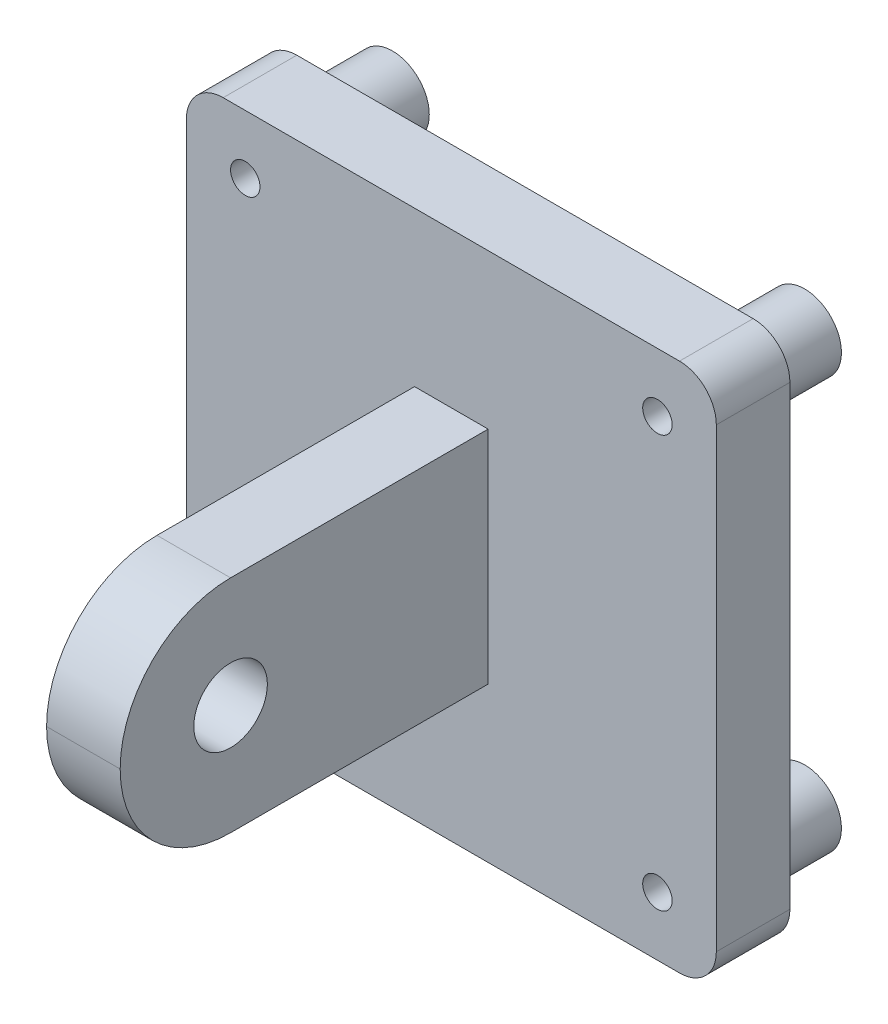
ISO-10303-21;
HEADER;
FILE_DESCRIPTION(('STEP AP214'),'2;1');
FILE_NAME('part.step','',(''),(''),'','','');
FILE_SCHEMA(('AUTOMOTIVE_DESIGN { 1 0 10303 214 1 1 1 1 }'));
ENDSEC;
DATA;
#1=APPLICATION_CONTEXT('core data for automotive mechanical design processes');
#2=APPLICATION_PROTOCOL_DEFINITION('international standard','automotive_design',2000,#1);
#3=PRODUCT_CONTEXT('',#1,'mechanical');
#4=PRODUCT('Part','Part','',(#3));
#5=PRODUCT_RELATED_PRODUCT_CATEGORY('part','',(#4));
#6=PRODUCT_DEFINITION_FORMATION('','',#4);
#7=PRODUCT_DEFINITION_CONTEXT('part definition',#1,'design');
#8=PRODUCT_DEFINITION('design','',#6,#7);
#9=PRODUCT_DEFINITION_SHAPE('','',#8);
#10=(LENGTH_UNIT() NAMED_UNIT(*) SI_UNIT(.MILLI.,.METRE.));
#11=(NAMED_UNIT(*) PLANE_ANGLE_UNIT() SI_UNIT($,.RADIAN.));
#12=(NAMED_UNIT(*) SI_UNIT($,.STERADIAN.) SOLID_ANGLE_UNIT());
#13=UNCERTAINTY_MEASURE_WITH_UNIT(LENGTH_MEASURE(1.E-05),#10,'distance_accuracy_value','');
#14=(GEOMETRIC_REPRESENTATION_CONTEXT(3) GLOBAL_UNCERTAINTY_ASSIGNED_CONTEXT((#13)) GLOBAL_UNIT_ASSIGNED_CONTEXT((#10,
#11,#12)) REPRESENTATION_CONTEXT('',''));
#15=CARTESIAN_POINT('',(0.,0.,0.));
#16=DIRECTION('',(0.,0.,1.));
#17=DIRECTION('',(1.,0.,0.));
#18=AXIS2_PLACEMENT_3D('',#15,#16,#17);
#19=CARTESIAN_POINT('',(14.,14.,-5.));
#20=DIRECTION('',(0.,0.,1.));
#21=DIRECTION('',(1.,0.,0.));
#22=AXIS2_PLACEMENT_3D('',#19,#20,#21);
#23=CYLINDRICAL_SURFACE('',#22,1.);
#24=CARTESIAN_POINT('',(14.,14.,-5.));
#25=DIRECTION('',(0.,0.,1.));
#26=DIRECTION('',(1.,0.,0.));
#27=AXIS2_PLACEMENT_3D('',#24,#25,#26);
#28=CIRCLE('',#27,1.);
#29=CARTESIAN_POINT('',(15.,14.,-5.));
#30=VERTEX_POINT('',#29);
#31=EDGE_CURVE('E47',#30,#30,#28,.T.);
#32=ORIENTED_EDGE('',*,*,#31,.F.);
#33=EDGE_LOOP('',(#32));
#34=FACE_BOUND('',#33,.T.);
#35=CARTESIAN_POINT('',(14.,14.,0.));
#36=DIRECTION('',(0.,0.,1.));
#37=DIRECTION('',(1.,0.,0.));
#38=AXIS2_PLACEMENT_3D('',#35,#36,#37);
#39=CIRCLE('',#38,1.);
#40=CARTESIAN_POINT('',(15.,14.,0.));
#41=VERTEX_POINT('',#40);
#42=EDGE_CURVE('E53',#41,#41,#39,.T.);
#43=ORIENTED_EDGE('',*,*,#42,.T.);
#44=EDGE_LOOP('',(#43));
#45=FACE_BOUND('',#44,.T.);
#46=ADVANCED_FACE('F40',(#34,#45),#23,.F.);
#47=CARTESIAN_POINT('',(14.,14.,-5.));
#48=DIRECTION('',(0.,0.,1.));
#49=DIRECTION('',(1.,0.,0.));
#50=AXIS2_PLACEMENT_3D('',#47,#48,#49);
#51=CYLINDRICAL_SURFACE('',#50,2.5);
#52=CARTESIAN_POINT('',(14.,14.,-5.));
#53=DIRECTION('',(0.,0.,1.));
#54=DIRECTION('',(1.,0.,0.));
#55=AXIS2_PLACEMENT_3D('',#52,#53,#54);
#56=CIRCLE('',#55,2.5);
#57=CARTESIAN_POINT('',(16.5,14.,-5.));
#58=VERTEX_POINT('',#57);
#59=EDGE_CURVE('E11',#58,#58,#56,.T.);
#60=ORIENTED_EDGE('',*,*,#59,.T.);
#61=EDGE_LOOP('',(#60));
#62=FACE_BOUND('',#61,.T.);
#63=CARTESIAN_POINT('',(14.,14.,0.));
#64=DIRECTION('',(0.,0.,1.));
#65=DIRECTION('',(1.,0.,0.));
#66=AXIS2_PLACEMENT_3D('',#63,#64,#65);
#67=CIRCLE('',#66,2.5);
#68=CARTESIAN_POINT('',(16.5,14.,0.));
#69=VERTEX_POINT('',#68);
#70=EDGE_CURVE('E43',#69,#69,#67,.T.);
#71=ORIENTED_EDGE('',*,*,#70,.F.);
#72=EDGE_LOOP('',(#71));
#73=FACE_BOUND('',#72,.T.);
#74=ADVANCED_FACE('F62',(#62,#73),#51,.T.);
#75=CARTESIAN_POINT('',(0.,0.,-5.));
#76=DIRECTION('',(0.,0.,1.));
#77=DIRECTION('',(1.,0.,0.));
#78=AXIS2_PLACEMENT_3D('',#75,#76,#77);
#79=PLANE('',#78);
#80=ORIENTED_EDGE('',*,*,#31,.T.);
#81=EDGE_LOOP('',(#80));
#82=FACE_BOUND('',#81,.T.);
#83=ORIENTED_EDGE('',*,*,#59,.F.);
#84=EDGE_LOOP('',(#83));
#85=FACE_BOUND('',#84,.T.);
#86=ADVANCED_FACE('F64',(#82,#85),#79,.F.);
#87=CARTESIAN_POINT('',(0.,0.,0.));
#88=DIRECTION('',(0.,0.,1.));
#89=DIRECTION('',(1.,0.,0.));
#90=AXIS2_PLACEMENT_3D('',#87,#88,#89);
#91=PLANE('',#90);
#92=ORIENTED_EDGE('',*,*,#42,.F.);
#93=EDGE_LOOP('',(#92));
#94=FACE_BOUND('',#93,.T.);
#95=ORIENTED_EDGE('',*,*,#70,.T.);
#96=EDGE_LOOP('',(#95));
#97=FACE_BOUND('',#96,.T.);
#98=ADVANCED_FACE('F60',(#94,#97),#91,.T.);
#99=CLOSED_SHELL('',(#46,#74,#86,#98));
#100=MANIFOLD_SOLID_BREP('B2',#99);
#101=CARTESIAN_POINT('',(0.,0.,5.));
#102=DIRECTION('',(0.,0.,1.));
#103=DIRECTION('',(1.,0.,0.));
#104=AXIS2_PLACEMENT_3D('',#101,#102,#103);
#105=PLANE('',#104);
#106=CARTESIAN_POINT('',(-14.,14.,5.));
#107=DIRECTION('',(0.,0.,1.));
#108=DIRECTION('',(1.,0.,0.));
#109=AXIS2_PLACEMENT_3D('',#106,#107,#108);
#110=CIRCLE('',#109,1.);
#111=CARTESIAN_POINT('',(-13.,14.,5.));
#112=VERTEX_POINT('',#111);
#113=EDGE_CURVE('E251',#112,#112,#110,.T.);
#114=ORIENTED_EDGE('',*,*,#113,.F.);
#115=EDGE_LOOP('',(#114));
#116=FACE_BOUND('',#115,.T.);
#117=CARTESIAN_POINT('',(14.,14.,5.));
#118=DIRECTION('',(0.,0.,1.));
#119=DIRECTION('',(1.,0.,0.));
#120=AXIS2_PLACEMENT_3D('',#117,#118,#119);
#121=CIRCLE('',#120,1.);
#122=CARTESIAN_POINT('',(15.,14.,5.));
#123=VERTEX_POINT('',#122);
#124=EDGE_CURVE('E254',#123,#123,#121,.T.);
#125=ORIENTED_EDGE('',*,*,#124,.F.);
#126=EDGE_LOOP('',(#125));
#127=FACE_BOUND('',#126,.T.);
#128=CARTESIAN_POINT('',(14.,-14.,5.));
#129=DIRECTION('',(0.,0.,1.));
#130=DIRECTION('',(1.,0.,0.));
#131=AXIS2_PLACEMENT_3D('',#128,#129,#130);
#132=CIRCLE('',#131,1.);
#133=CARTESIAN_POINT('',(15.,-14.,5.));
#134=VERTEX_POINT('',#133);
#135=EDGE_CURVE('E258',#134,#134,#132,.T.);
#136=ORIENTED_EDGE('',*,*,#135,.F.);
#137=EDGE_LOOP('',(#136));
#138=FACE_BOUND('',#137,.T.);
#139=CARTESIAN_POINT('',(-14.,-14.,5.));
#140=DIRECTION('',(0.,0.,1.));
#141=DIRECTION('',(1.,0.,0.));
#142=AXIS2_PLACEMENT_3D('',#139,#140,#141);
#143=CIRCLE('',#142,1.);
#144=CARTESIAN_POINT('',(-13.,-14.,5.));
#145=VERTEX_POINT('',#144);
#146=EDGE_CURVE('E261',#145,#145,#143,.T.);
#147=ORIENTED_EDGE('',*,*,#146,.F.);
#148=EDGE_LOOP('',(#147));
#149=FACE_BOUND('',#148,.T.);
#150=DIRECTION('',(0.,1.,0.));
#151=VECTOR('',#150,1.);
#152=CARTESIAN_POINT('',(18.,0.,5.));
#153=LINE('',#152,#151);
#154=CARTESIAN_POINT('',(18.,-15.5,5.));
#155=VERTEX_POINT('',#154);
#156=CARTESIAN_POINT('',(18.,15.5,5.));
#157=VERTEX_POINT('',#156);
#158=EDGE_CURVE('E267',#155,#157,#153,.T.);
#159=ORIENTED_EDGE('',*,*,#158,.T.);
#160=CARTESIAN_POINT('',(15.5,15.5,5.));
#161=DIRECTION('',(0.,0.,1.));
#162=DIRECTION('',(1.,0.,0.));
#163=AXIS2_PLACEMENT_3D('',#160,#161,#162);
#164=CIRCLE('',#163,2.5);
#165=CARTESIAN_POINT('',(15.5,18.,5.));
#166=VERTEX_POINT('',#165);
#167=EDGE_CURVE('E322',#157,#166,#164,.T.);
#168=ORIENTED_EDGE('',*,*,#167,.T.);
#169=DIRECTION('',(1.,0.,0.));
#170=VECTOR('',#169,1.);
#171=CARTESIAN_POINT('',(0.,18.,5.));
#172=LINE('',#171,#170);
#173=CARTESIAN_POINT('',(-15.5,18.,5.));
#174=VERTEX_POINT('',#173);
#175=EDGE_CURVE('E270',#174,#166,#172,.T.);
#176=ORIENTED_EDGE('',*,*,#175,.F.);
#177=CARTESIAN_POINT('',(-15.5,15.5,5.));
#178=DIRECTION('',(0.,0.,1.));
#179=DIRECTION('',(1.,0.,0.));
#180=AXIS2_PLACEMENT_3D('',#177,#178,#179);
#181=CIRCLE('',#180,2.5);
#182=CARTESIAN_POINT('',(-18.,15.5,5.));
#183=VERTEX_POINT('',#182);
#184=EDGE_CURVE('E320',#174,#183,#181,.T.);
#185=ORIENTED_EDGE('',*,*,#184,.T.);
#186=DIRECTION('',(0.,1.,0.));
#187=VECTOR('',#186,1.);
#188=CARTESIAN_POINT('',(-18.,0.,5.));
#189=LINE('',#188,#187);
#190=CARTESIAN_POINT('',(-18.,-15.5,5.));
#191=VERTEX_POINT('',#190);
#192=EDGE_CURVE('E273',#191,#183,#189,.T.);
#193=ORIENTED_EDGE('',*,*,#192,.F.);
#194=CARTESIAN_POINT('',(-15.5,-15.5,5.));
#195=DIRECTION('',(0.,0.,1.));
#196=DIRECTION('',(1.,0.,0.));
#197=AXIS2_PLACEMENT_3D('',#194,#195,#196);
#198=CIRCLE('',#197,2.5);
#199=CARTESIAN_POINT('',(-15.5,-18.,5.));
#200=VERTEX_POINT('',#199);
#201=EDGE_CURVE('E318',#191,#200,#198,.T.);
#202=ORIENTED_EDGE('',*,*,#201,.T.);
#203=DIRECTION('',(1.,0.,0.));
#204=VECTOR('',#203,1.);
#205=CARTESIAN_POINT('',(0.,-18.,5.));
#206=LINE('',#205,#204);
#207=CARTESIAN_POINT('',(15.5,-18.,5.));
#208=VERTEX_POINT('',#207);
#209=EDGE_CURVE('E264',#200,#208,#206,.T.);
#210=ORIENTED_EDGE('',*,*,#209,.T.);
#211=CARTESIAN_POINT('',(15.5,-15.5,5.));
#212=DIRECTION('',(0.,0.,1.));
#213=DIRECTION('',(1.,0.,0.));
#214=AXIS2_PLACEMENT_3D('',#211,#212,#213);
#215=CIRCLE('',#214,2.5);
#216=EDGE_CURVE('E316',#208,#155,#215,.T.);
#217=ORIENTED_EDGE('',*,*,#216,.T.);
#218=EDGE_LOOP('',(#159,#168,#176,#185,#193,#202,#210,#217));
#219=FACE_BOUND('',#218,.T.);
#220=DIRECTION('',(-1.,0.,0.));
#221=VECTOR('',#220,1.);
#222=CARTESIAN_POINT('',(-2.5,7.5,5.));
#223=LINE('',#222,#221);
#224=CARTESIAN_POINT('',(2.5,7.5,5.));
#225=VERTEX_POINT('',#224);
#226=CARTESIAN_POINT('',(-2.5,7.5,5.));
#227=VERTEX_POINT('',#226);
#228=EDGE_CURVE('E204',#225,#227,#223,.T.);
#229=ORIENTED_EDGE('',*,*,#228,.F.);
#230=DIRECTION('',(0.,1.,0.));
#231=VECTOR('',#230,1.);
#232=CARTESIAN_POINT('',(2.5,-7.5,5.));
#233=LINE('',#232,#231);
#234=CARTESIAN_POINT('',(2.5,-7.5,5.));
#235=VERTEX_POINT('',#234);
#236=EDGE_CURVE('E213',#235,#225,#233,.T.);
#237=ORIENTED_EDGE('',*,*,#236,.F.);
#238=DIRECTION('',(1.,0.,0.));
#239=VECTOR('',#238,1.);
#240=CARTESIAN_POINT('',(-2.5,-7.5,5.));
#241=LINE('',#240,#239);
#242=CARTESIAN_POINT('',(-2.5,-7.5,5.));
#243=VERTEX_POINT('',#242);
#244=EDGE_CURVE('E224',#243,#235,#241,.T.);
#245=ORIENTED_EDGE('',*,*,#244,.F.);
#246=DIRECTION('',(0.,-1.,0.));
#247=VECTOR('',#246,1.);
#248=CARTESIAN_POINT('',(-2.5,-7.5,5.));
#249=LINE('',#248,#247);
#250=EDGE_CURVE('E222',#227,#243,#249,.T.);
#251=ORIENTED_EDGE('',*,*,#250,.F.);
#252=EDGE_LOOP('',(#229,#237,#245,#251));
#253=FACE_BOUND('',#252,.T.);
#254=ADVANCED_FACE('F108',(#116,#127,#138,#149,#219,#253),#105,.T.);
#255=CARTESIAN_POINT('',(-14.,14.,-5.));
#256=DIRECTION('',(0.,0.,1.));
#257=DIRECTION('',(1.,0.,0.));
#258=AXIS2_PLACEMENT_3D('',#255,#256,#257);
#259=CYLINDRICAL_SURFACE('',#258,2.5);
#260=CARTESIAN_POINT('',(-14.,14.,-5.));
#261=DIRECTION('',(0.,0.,1.));
#262=DIRECTION('',(1.,0.,0.));
#263=AXIS2_PLACEMENT_3D('',#260,#261,#262);
#264=CIRCLE('',#263,2.5);
#265=CARTESIAN_POINT('',(-11.5,14.,-5.));
#266=VERTEX_POINT('',#265);
#267=EDGE_CURVE('E290',#266,#266,#264,.T.);
#268=ORIENTED_EDGE('',*,*,#267,.T.);
#269=EDGE_LOOP('',(#268));
#270=FACE_BOUND('',#269,.T.);
#271=CARTESIAN_POINT('',(-14.,14.,0.));
#272=DIRECTION('',(0.,0.,1.));
#273=DIRECTION('',(1.,0.,0.));
#274=AXIS2_PLACEMENT_3D('',#271,#272,#273);
#275=CIRCLE('',#274,2.5);
#276=CARTESIAN_POINT('',(-11.5,14.,0.));
#277=VERTEX_POINT('',#276);
#278=EDGE_CURVE('E276',#277,#277,#275,.T.);
#279=ORIENTED_EDGE('',*,*,#278,.F.);
#280=EDGE_LOOP('',(#279));
#281=FACE_BOUND('',#280,.T.);
#282=ADVANCED_FACE('F376',(#270,#281),#259,.T.);
#283=CARTESIAN_POINT('',(-14.,14.,-5.));
#284=DIRECTION('',(0.,0.,1.));
#285=DIRECTION('',(1.,0.,0.));
#286=AXIS2_PLACEMENT_3D('',#283,#284,#285);
#287=CYLINDRICAL_SURFACE('',#286,1.);
#288=CARTESIAN_POINT('',(-14.,14.,-5.));
#289=DIRECTION('',(0.,0.,1.));
#290=DIRECTION('',(1.,0.,0.));
#291=AXIS2_PLACEMENT_3D('',#288,#289,#290);
#292=CIRCLE('',#291,1.);
#293=CARTESIAN_POINT('',(-13.,14.,-5.));
#294=VERTEX_POINT('',#293);
#295=EDGE_CURVE('E293',#294,#294,#292,.T.);
#296=ORIENTED_EDGE('',*,*,#295,.F.);
#297=EDGE_LOOP('',(#296));
#298=FACE_BOUND('',#297,.T.);
#299=ORIENTED_EDGE('',*,*,#113,.T.);
#300=EDGE_LOOP('',(#299));
#301=FACE_BOUND('',#300,.T.);
#302=ADVANCED_FACE('F384',(#298,#301),#287,.F.);
#303=CARTESIAN_POINT('',(0.,0.,-5.));
#304=DIRECTION('',(0.,0.,1.));
#305=DIRECTION('',(1.,0.,0.));
#306=AXIS2_PLACEMENT_3D('',#303,#304,#305);
#307=PLANE('',#306);
#308=ORIENTED_EDGE('',*,*,#267,.F.);
#309=EDGE_LOOP('',(#308));
#310=FACE_BOUND('',#309,.T.);
#311=ORIENTED_EDGE('',*,*,#295,.T.);
#312=EDGE_LOOP('',(#311));
#313=FACE_BOUND('',#312,.T.);
#314=ADVANCED_FACE('F414',(#310,#313),#307,.F.);
#315=CARTESIAN_POINT('',(0.,-18.,5.));
#316=DIRECTION('',(0.,1.,0.));
#317=DIRECTION('',(0.,0.,1.));
#318=AXIS2_PLACEMENT_3D('',#315,#316,#317);
#319=PLANE('',#318);
#320=ORIENTED_EDGE('',*,*,#209,.F.);
#321=DIRECTION('',(0.,0.,-1.));
#322=VECTOR('',#321,1.);
#323=CARTESIAN_POINT('',(-15.5,-18.,0.));
#324=LINE('',#323,#322);
#325=CARTESIAN_POINT('',(-15.5,-18.,0.));
#326=VERTEX_POINT('',#325);
#327=EDGE_CURVE('E331',#200,#326,#324,.T.);
#328=ORIENTED_EDGE('',*,*,#327,.T.);
#329=DIRECTION('',(1.,0.,0.));
#330=VECTOR('',#329,1.);
#331=CARTESIAN_POINT('',(0.,-18.,0.));
#332=LINE('',#331,#330);
#333=CARTESIAN_POINT('',(15.5,-18.,0.));
#334=VERTEX_POINT('',#333);
#335=EDGE_CURVE('E279',#326,#334,#332,.T.);
#336=ORIENTED_EDGE('',*,*,#335,.T.);
#337=DIRECTION('',(0.,0.,-1.));
#338=VECTOR('',#337,1.);
#339=CARTESIAN_POINT('',(15.5,-18.,5.));
#340=LINE('',#339,#338);
#341=EDGE_CURVE('E329',#334,#208,#340,.F.);
#342=ORIENTED_EDGE('',*,*,#341,.T.);
#343=EDGE_LOOP('',(#320,#328,#336,#342));
#344=FACE_BOUND('',#343,.T.);
#345=ADVANCED_FACE('F410',(#344),#319,.F.);
#346=CARTESIAN_POINT('',(18.,0.,5.));
#347=DIRECTION('',(-1.,0.,0.));
#348=DIRECTION('',(0.,0.,1.));
#349=AXIS2_PLACEMENT_3D('',#346,#347,#348);
#350=PLANE('',#349);
#351=DIRECTION('',(0.,1.,0.));
#352=VECTOR('',#351,1.);
#353=CARTESIAN_POINT('',(18.,0.,0.));
#354=LINE('',#353,#352);
#355=CARTESIAN_POINT('',(18.,-15.5,0.));
#356=VERTEX_POINT('',#355);
#357=CARTESIAN_POINT('',(18.,15.5,0.));
#358=VERTEX_POINT('',#357);
#359=EDGE_CURVE('E282',#356,#358,#354,.T.);
#360=ORIENTED_EDGE('',*,*,#359,.T.);
#361=DIRECTION('',(0.,0.,-1.));
#362=VECTOR('',#361,1.);
#363=CARTESIAN_POINT('',(18.,15.5,5.));
#364=LINE('',#363,#362);
#365=EDGE_CURVE('E314',#358,#157,#364,.F.);
#366=ORIENTED_EDGE('',*,*,#365,.T.);
#367=ORIENTED_EDGE('',*,*,#158,.F.);
#368=DIRECTION('',(0.,0.,-1.));
#369=VECTOR('',#368,1.);
#370=CARTESIAN_POINT('',(18.,-15.5,5.));
#371=LINE('',#370,#369);
#372=EDGE_CURVE('E311',#155,#356,#371,.T.);
#373=ORIENTED_EDGE('',*,*,#372,.T.);
#374=EDGE_LOOP('',(#360,#366,#367,#373));
#375=FACE_BOUND('',#374,.T.);
#376=ADVANCED_FACE('F406',(#375),#350,.F.);
#377=CARTESIAN_POINT('',(0.,18.,5.));
#378=DIRECTION('',(0.,1.,0.));
#379=DIRECTION('',(0.,0.,1.));
#380=AXIS2_PLACEMENT_3D('',#377,#378,#379);
#381=PLANE('',#380);
#382=ORIENTED_EDGE('',*,*,#175,.T.);
#383=DIRECTION('',(0.,0.,-1.));
#384=VECTOR('',#383,1.);
#385=CARTESIAN_POINT('',(15.5,18.,0.));
#386=LINE('',#385,#384);
#387=CARTESIAN_POINT('',(15.5,18.,0.));
#388=VERTEX_POINT('',#387);
#389=EDGE_CURVE('E300',#166,#388,#386,.T.);
#390=ORIENTED_EDGE('',*,*,#389,.T.);
#391=DIRECTION('',(1.,0.,0.));
#392=VECTOR('',#391,1.);
#393=CARTESIAN_POINT('',(0.,18.,0.));
#394=LINE('',#393,#392);
#395=CARTESIAN_POINT('',(-15.5,18.,0.));
#396=VERTEX_POINT('',#395);
#397=EDGE_CURVE('E285',#396,#388,#394,.T.);
#398=ORIENTED_EDGE('',*,*,#397,.F.);
#399=DIRECTION('',(0.,0.,-1.));
#400=VECTOR('',#399,1.);
#401=CARTESIAN_POINT('',(-15.5,18.,5.));
#402=LINE('',#401,#400);
#403=EDGE_CURVE('E296',#396,#174,#402,.F.);
#404=ORIENTED_EDGE('',*,*,#403,.T.);
#405=EDGE_LOOP('',(#382,#390,#398,#404));
#406=FACE_BOUND('',#405,.T.);
#407=ADVANCED_FACE('F402',(#406),#381,.T.);
#408=CARTESIAN_POINT('',(-14.,-14.,5.));
#409=DIRECTION('',(0.,0.,-1.));
#410=DIRECTION('',(-1.,0.,0.));
#411=AXIS2_PLACEMENT_3D('',#408,#409,#410);
#412=CYLINDRICAL_SURFACE('',#411,1.);
#413=ORIENTED_EDGE('',*,*,#146,.T.);
#414=EDGE_LOOP('',(#413));
#415=FACE_BOUND('',#414,.T.);
#416=CARTESIAN_POINT('',(-14.,-14.,-5.));
#417=DIRECTION('',(0.,0.,1.));
#418=DIRECTION('',(1.,0.,0.));
#419=AXIS2_PLACEMENT_3D('',#416,#417,#418);
#420=CIRCLE('',#419,1.);
#421=CARTESIAN_POINT('',(-13.,-14.,-5.));
#422=VERTEX_POINT('',#421);
#423=EDGE_CURVE('E245',#422,#422,#420,.T.);
#424=ORIENTED_EDGE('',*,*,#423,.F.);
#425=EDGE_LOOP('',(#424));
#426=FACE_BOUND('',#425,.T.);
#427=ADVANCED_FACE('F405',(#415,#426),#412,.F.);
#428=CARTESIAN_POINT('',(14.,-14.,5.));
#429=DIRECTION('',(0.,0.,-1.));
#430=DIRECTION('',(-1.,0.,0.));
#431=AXIS2_PLACEMENT_3D('',#428,#429,#430);
#432=CYLINDRICAL_SURFACE('',#431,1.);
#433=ORIENTED_EDGE('',*,*,#135,.T.);
#434=EDGE_LOOP('',(#433));
#435=FACE_BOUND('',#434,.T.);
#436=CARTESIAN_POINT('',(14.,-14.,-5.));
#437=DIRECTION('',(0.,0.,1.));
#438=DIRECTION('',(1.,0.,0.));
#439=AXIS2_PLACEMENT_3D('',#436,#437,#438);
#440=CIRCLE('',#439,1.);
#441=CARTESIAN_POINT('',(15.,-14.,-5.));
#442=VERTEX_POINT('',#441);
#443=EDGE_CURVE('E233',#442,#442,#440,.T.);
#444=ORIENTED_EDGE('',*,*,#443,.F.);
#445=EDGE_LOOP('',(#444));
#446=FACE_BOUND('',#445,.T.);
#447=ADVANCED_FACE('F418',(#435,#446),#432,.F.);
#448=CARTESIAN_POINT('',(14.,14.,5.));
#449=DIRECTION('',(0.,0.,-1.));
#450=DIRECTION('',(-1.,0.,0.));
#451=AXIS2_PLACEMENT_3D('',#448,#449,#450);
#452=CYLINDRICAL_SURFACE('',#451,1.);
#453=ORIENTED_EDGE('',*,*,#124,.T.);
#454=EDGE_LOOP('',(#453));
#455=FACE_BOUND('',#454,.T.);
#456=CARTESIAN_POINT('',(14.,14.,0.));
#457=DIRECTION('',(0.,0.,1.));
#458=DIRECTION('',(1.,0.,0.));
#459=AXIS2_PLACEMENT_3D('',#456,#457,#458);
#460=CIRCLE('',#459,1.);
#461=CARTESIAN_POINT('',(15.,14.,0.));
#462=VERTEX_POINT('',#461);
#463=EDGE_CURVE('E248',#462,#462,#460,.T.);
#464=ORIENTED_EDGE('',*,*,#463,.F.);
#465=EDGE_LOOP('',(#464));
#466=FACE_BOUND('',#465,.T.);
#467=ADVANCED_FACE('F400',(#455,#466),#452,.F.);
#468=CARTESIAN_POINT('',(-18.,0.,5.));
#469=DIRECTION('',(-1.,0.,0.));
#470=DIRECTION('',(0.,0.,1.));
#471=AXIS2_PLACEMENT_3D('',#468,#469,#470);
#472=PLANE('',#471);
#473=ORIENTED_EDGE('',*,*,#192,.T.);
#474=DIRECTION('',(0.,0.,-1.));
#475=VECTOR('',#474,1.);
#476=CARTESIAN_POINT('',(-18.,15.5,5.));
#477=LINE('',#476,#475);
#478=CARTESIAN_POINT('',(-18.,15.5,0.));
#479=VERTEX_POINT('',#478);
#480=EDGE_CURVE('E326',#183,#479,#477,.T.);
#481=ORIENTED_EDGE('',*,*,#480,.T.);
#482=DIRECTION('',(0.,1.,0.));
#483=VECTOR('',#482,1.);
#484=CARTESIAN_POINT('',(-18.,0.,0.));
#485=LINE('',#484,#483);
#486=CARTESIAN_POINT('',(-18.,-15.5,0.));
#487=VERTEX_POINT('',#486);
#488=EDGE_CURVE('E255',#487,#479,#485,.T.);
#489=ORIENTED_EDGE('',*,*,#488,.F.);
#490=DIRECTION('',(0.,0.,-1.));
#491=VECTOR('',#490,1.);
#492=CARTESIAN_POINT('',(-18.,-15.5,5.));
#493=LINE('',#492,#491);
#494=EDGE_CURVE('E324',#487,#191,#493,.F.);
#495=ORIENTED_EDGE('',*,*,#494,.T.);
#496=EDGE_LOOP('',(#473,#481,#489,#495));
#497=FACE_BOUND('',#496,.T.);
#498=ADVANCED_FACE('F396',(#497),#472,.T.);
#499=CARTESIAN_POINT('',(0.,0.,0.));
#500=DIRECTION('',(0.,0.,1.));
#501=DIRECTION('',(1.,0.,0.));
#502=AXIS2_PLACEMENT_3D('',#499,#500,#501);
#503=PLANE('',#502);
#504=CARTESIAN_POINT('',(14.,-14.,0.));
#505=DIRECTION('',(0.,0.,1.));
#506=DIRECTION('',(1.,0.,0.));
#507=AXIS2_PLACEMENT_3D('',#504,#505,#506);
#508=CIRCLE('',#507,2.5);
#509=CARTESIAN_POINT('',(16.5,-14.,0.));
#510=VERTEX_POINT('',#509);
#511=EDGE_CURVE('E209',#510,#510,#508,.T.);
#512=ORIENTED_EDGE('',*,*,#511,.T.);
#513=EDGE_LOOP('',(#512));
#514=FACE_BOUND('',#513,.T.);
#515=CARTESIAN_POINT('',(-14.,-14.,0.));
#516=DIRECTION('',(0.,0.,1.));
#517=DIRECTION('',(1.,0.,0.));
#518=AXIS2_PLACEMENT_3D('',#515,#516,#517);
#519=CIRCLE('',#518,2.5);
#520=CARTESIAN_POINT('',(-11.5,-14.,0.));
#521=VERTEX_POINT('',#520);
#522=EDGE_CURVE('E239',#521,#521,#519,.T.);
#523=ORIENTED_EDGE('',*,*,#522,.T.);
#524=EDGE_LOOP('',(#523));
#525=FACE_BOUND('',#524,.T.);
#526=ORIENTED_EDGE('',*,*,#278,.T.);
#527=EDGE_LOOP('',(#526));
#528=FACE_BOUND('',#527,.T.);
#529=ORIENTED_EDGE('',*,*,#463,.T.);
#530=EDGE_LOOP('',(#529));
#531=FACE_BOUND('',#530,.T.);
#532=ORIENTED_EDGE('',*,*,#397,.T.);
#533=CARTESIAN_POINT('',(15.5,15.5,0.));
#534=DIRECTION('',(0.,0.,1.));
#535=DIRECTION('',(1.,0.,0.));
#536=AXIS2_PLACEMENT_3D('',#533,#534,#535);
#537=CIRCLE('',#536,2.5);
#538=EDGE_CURVE('E309',#388,#358,#537,.F.);
#539=ORIENTED_EDGE('',*,*,#538,.T.);
#540=ORIENTED_EDGE('',*,*,#359,.F.);
#541=CARTESIAN_POINT('',(15.5,-15.5,0.));
#542=DIRECTION('',(0.,0.,1.));
#543=DIRECTION('',(1.,0.,0.));
#544=AXIS2_PLACEMENT_3D('',#541,#542,#543);
#545=CIRCLE('',#544,2.5);
#546=EDGE_CURVE('E303',#356,#334,#545,.F.);
#547=ORIENTED_EDGE('',*,*,#546,.T.);
#548=ORIENTED_EDGE('',*,*,#335,.F.);
#549=CARTESIAN_POINT('',(-15.5,-15.5,0.));
#550=DIRECTION('',(0.,0.,1.));
#551=DIRECTION('',(1.,0.,0.));
#552=AXIS2_PLACEMENT_3D('',#549,#550,#551);
#553=CIRCLE('',#552,2.5);
#554=EDGE_CURVE('E305',#326,#487,#553,.F.);
#555=ORIENTED_EDGE('',*,*,#554,.T.);
#556=ORIENTED_EDGE('',*,*,#488,.T.);
#557=CARTESIAN_POINT('',(-15.5,15.5,0.));
#558=DIRECTION('',(0.,0.,1.));
#559=DIRECTION('',(1.,0.,0.));
#560=AXIS2_PLACEMENT_3D('',#557,#558,#559);
#561=CIRCLE('',#560,2.5);
#562=EDGE_CURVE('E307',#479,#396,#561,.F.);
#563=ORIENTED_EDGE('',*,*,#562,.T.);
#564=EDGE_LOOP('',(#532,#539,#540,#547,#548,#555,#556,#563));
#565=FACE_BOUND('',#564,.T.);
#566=ADVANCED_FACE('F393',(#514,#525,#528,#531,#565),#503,.F.);
#567=CARTESIAN_POINT('',(-14.,-14.,-5.));
#568=DIRECTION('',(0.,0.,1.));
#569=DIRECTION('',(1.,0.,0.));
#570=AXIS2_PLACEMENT_3D('',#567,#568,#569);
#571=CYLINDRICAL_SURFACE('',#570,2.5);
#572=CARTESIAN_POINT('',(-14.,-14.,-5.));
#573=DIRECTION('',(0.,0.,1.));
#574=DIRECTION('',(1.,0.,0.));
#575=AXIS2_PLACEMENT_3D('',#572,#573,#574);
#576=CIRCLE('',#575,2.5);
#577=CARTESIAN_POINT('',(-11.5,-14.,-5.));
#578=VERTEX_POINT('',#577);
#579=EDGE_CURVE('E242',#578,#578,#576,.T.);
#580=ORIENTED_EDGE('',*,*,#579,.T.);
#581=EDGE_LOOP('',(#580));
#582=FACE_BOUND('',#581,.T.);
#583=ORIENTED_EDGE('',*,*,#522,.F.);
#584=EDGE_LOOP('',(#583));
#585=FACE_BOUND('',#584,.T.);
#586=ADVANCED_FACE('F391',(#582,#585),#571,.T.);
#587=CARTESIAN_POINT('',(0.,0.,-5.));
#588=DIRECTION('',(0.,0.,1.));
#589=DIRECTION('',(1.,0.,0.));
#590=AXIS2_PLACEMENT_3D('',#587,#588,#589);
#591=PLANE('',#590);
#592=ORIENTED_EDGE('',*,*,#579,.F.);
#593=EDGE_LOOP('',(#592));
#594=FACE_BOUND('',#593,.T.);
#595=ORIENTED_EDGE('',*,*,#423,.T.);
#596=EDGE_LOOP('',(#595));
#597=FACE_BOUND('',#596,.T.);
#598=ADVANCED_FACE('F550',(#594,#597),#591,.F.);
#599=CARTESIAN_POINT('',(14.,-14.,-5.));
#600=DIRECTION('',(0.,0.,1.));
#601=DIRECTION('',(1.,0.,0.));
#602=AXIS2_PLACEMENT_3D('',#599,#600,#601);
#603=CYLINDRICAL_SURFACE('',#602,2.5);
#604=CARTESIAN_POINT('',(14.,-14.,-5.));
#605=DIRECTION('',(0.,0.,1.));
#606=DIRECTION('',(1.,0.,0.));
#607=AXIS2_PLACEMENT_3D('',#604,#605,#606);
#608=CIRCLE('',#607,2.5);
#609=CARTESIAN_POINT('',(16.5,-14.,-5.));
#610=VERTEX_POINT('',#609);
#611=EDGE_CURVE('E236',#610,#610,#608,.T.);
#612=ORIENTED_EDGE('',*,*,#611,.T.);
#613=EDGE_LOOP('',(#612));
#614=FACE_BOUND('',#613,.T.);
#615=ORIENTED_EDGE('',*,*,#511,.F.);
#616=EDGE_LOOP('',(#615));
#617=FACE_BOUND('',#616,.T.);
#618=ADVANCED_FACE('F558',(#614,#617),#603,.T.);
#619=CARTESIAN_POINT('',(0.,0.,-5.));
#620=DIRECTION('',(0.,0.,1.));
#621=DIRECTION('',(1.,0.,0.));
#622=AXIS2_PLACEMENT_3D('',#619,#620,#621);
#623=PLANE('',#622);
#624=ORIENTED_EDGE('',*,*,#443,.T.);
#625=EDGE_LOOP('',(#624));
#626=FACE_BOUND('',#625,.T.);
#627=ORIENTED_EDGE('',*,*,#611,.F.);
#628=EDGE_LOOP('',(#627));
#629=FACE_BOUND('',#628,.T.);
#630=ADVANCED_FACE('F436',(#626,#629),#623,.F.);
#631=CARTESIAN_POINT('',(15.5,15.5,5.));
#632=DIRECTION('',(0.,0.,1.));
#633=DIRECTION('',(1.,0.,0.));
#634=AXIS2_PLACEMENT_3D('',#631,#632,#633);
#635=CYLINDRICAL_SURFACE('',#634,2.5);
#636=ORIENTED_EDGE('',*,*,#167,.F.);
#637=ORIENTED_EDGE('',*,*,#365,.F.);
#638=ORIENTED_EDGE('',*,*,#538,.F.);
#639=ORIENTED_EDGE('',*,*,#389,.F.);
#640=EDGE_LOOP('',(#636,#637,#638,#639));
#641=FACE_BOUND('',#640,.T.);
#642=ADVANCED_FACE('F432',(#641),#635,.T.);
#643=CARTESIAN_POINT('',(-15.5,15.5,5.));
#644=DIRECTION('',(0.,0.,-1.));
#645=DIRECTION('',(-1.,0.,0.));
#646=AXIS2_PLACEMENT_3D('',#643,#644,#645);
#647=CYLINDRICAL_SURFACE('',#646,2.5);
#648=ORIENTED_EDGE('',*,*,#184,.F.);
#649=ORIENTED_EDGE('',*,*,#403,.F.);
#650=ORIENTED_EDGE('',*,*,#562,.F.);
#651=ORIENTED_EDGE('',*,*,#480,.F.);
#652=EDGE_LOOP('',(#648,#649,#650,#651));
#653=FACE_BOUND('',#652,.T.);
#654=ADVANCED_FACE('F435',(#653),#647,.T.);
#655=CARTESIAN_POINT('',(-15.5,-15.5,5.));
#656=DIRECTION('',(0.,0.,1.));
#657=DIRECTION('',(1.,0.,0.));
#658=AXIS2_PLACEMENT_3D('',#655,#656,#657);
#659=CYLINDRICAL_SURFACE('',#658,2.5);
#660=ORIENTED_EDGE('',*,*,#201,.F.);
#661=ORIENTED_EDGE('',*,*,#494,.F.);
#662=ORIENTED_EDGE('',*,*,#554,.F.);
#663=ORIENTED_EDGE('',*,*,#327,.F.);
#664=EDGE_LOOP('',(#660,#661,#662,#663));
#665=FACE_BOUND('',#664,.T.);
#666=ADVANCED_FACE('F371',(#665),#659,.T.);
#667=CARTESIAN_POINT('',(15.5,-15.5,5.));
#668=DIRECTION('',(0.,0.,-1.));
#669=DIRECTION('',(-1.,0.,0.));
#670=AXIS2_PLACEMENT_3D('',#667,#668,#669);
#671=CYLINDRICAL_SURFACE('',#670,2.5);
#672=ORIENTED_EDGE('',*,*,#216,.F.);
#673=ORIENTED_EDGE('',*,*,#341,.F.);
#674=ORIENTED_EDGE('',*,*,#546,.F.);
#675=ORIENTED_EDGE('',*,*,#372,.F.);
#676=EDGE_LOOP('',(#672,#673,#674,#675));
#677=FACE_BOUND('',#676,.T.);
#678=ADVANCED_FACE('F364',(#677),#671,.T.);
#679=CARTESIAN_POINT('',(2.5,-7.5,30.));
#680=DIRECTION('',(-1.,0.,0.));
#681=DIRECTION('',(0.,0.,1.));
#682=AXIS2_PLACEMENT_3D('',#679,#680,#681);
#683=PLANE('',#682);
#684=CARTESIAN_POINT('',(2.5,0.,22.5));
#685=DIRECTION('',(1.,0.,0.));
#686=DIRECTION('',(0.,0.,-1.));
#687=AXIS2_PLACEMENT_3D('',#684,#685,#686);
#688=CIRCLE('',#687,2.5);
#689=CARTESIAN_POINT('',(2.5,0.,20.));
#690=VERTEX_POINT('',#689);
#691=EDGE_CURVE('E354',#690,#690,#688,.T.);
#692=ORIENTED_EDGE('',*,*,#691,.F.);
#693=EDGE_LOOP('',(#692));
#694=FACE_BOUND('',#693,.T.);
#695=CARTESIAN_POINT('',(2.5,0.,22.5));
#696=DIRECTION('',(-1.,0.,0.));
#697=DIRECTION('',(0.,0.,1.));
#698=AXIS2_PLACEMENT_3D('',#695,#696,#697);
#699=CIRCLE('',#698,7.5);
#700=CARTESIAN_POINT('',(2.5,7.5,22.5));
#701=VERTEX_POINT('',#700);
#702=CARTESIAN_POINT('',(2.5,0.,30.));
#703=VERTEX_POINT('',#702);
#704=EDGE_CURVE('E334',#701,#703,#699,.F.);
#705=ORIENTED_EDGE('',*,*,#704,.T.);
#706=CARTESIAN_POINT('',(2.5,0.,22.5));
#707=DIRECTION('',(-1.,0.,0.));
#708=DIRECTION('',(0.,0.,1.));
#709=AXIS2_PLACEMENT_3D('',#706,#707,#708);
#710=CIRCLE('',#709,7.5);
#711=CARTESIAN_POINT('',(2.5,-7.5,22.5));
#712=VERTEX_POINT('',#711);
#713=EDGE_CURVE('E336',#703,#712,#710,.F.);
#714=ORIENTED_EDGE('',*,*,#713,.T.);
#715=DIRECTION('',(0.,0.,-1.));
#716=VECTOR('',#715,1.);
#717=CARTESIAN_POINT('',(2.5,-7.5,30.));
#718=LINE('',#717,#716);
#719=EDGE_CURVE('E216',#712,#235,#718,.T.);
#720=ORIENTED_EDGE('',*,*,#719,.T.);
#721=ORIENTED_EDGE('',*,*,#236,.T.);
#722=DIRECTION('',(0.,0.,-1.));
#723=VECTOR('',#722,1.);
#724=CARTESIAN_POINT('',(2.5,7.5,30.));
#725=LINE('',#724,#723);
#726=EDGE_CURVE('E200',#701,#225,#725,.T.);
#727=ORIENTED_EDGE('',*,*,#726,.F.);
#728=EDGE_LOOP('',(#705,#714,#720,#721,#727));
#729=FACE_BOUND('',#728,.T.);
#730=ADVANCED_FACE('F214',(#694,#729),#683,.F.);
#731=CARTESIAN_POINT('',(-2.5,7.5,30.));
#732=DIRECTION('',(0.,-1.,0.));
#733=DIRECTION('',(0.,0.,-1.));
#734=AXIS2_PLACEMENT_3D('',#731,#732,#733);
#735=PLANE('',#734);
#736=DIRECTION('',(0.,0.,-1.));
#737=VECTOR('',#736,1.);
#738=CARTESIAN_POINT('',(-2.5,7.5,30.));
#739=LINE('',#738,#737);
#740=CARTESIAN_POINT('',(-2.5,7.5,22.5));
#741=VERTEX_POINT('',#740);
#742=EDGE_CURVE('E210',#741,#227,#739,.T.);
#743=ORIENTED_EDGE('',*,*,#742,.F.);
#744=DIRECTION('',(-1.,0.,0.));
#745=VECTOR('',#744,1.);
#746=CARTESIAN_POINT('',(-2.5,7.5,22.5));
#747=LINE('',#746,#745);
#748=EDGE_CURVE('E38',#741,#701,#747,.F.);
#749=ORIENTED_EDGE('',*,*,#748,.T.);
#750=ORIENTED_EDGE('',*,*,#726,.T.);
#751=ORIENTED_EDGE('',*,*,#228,.T.);
#752=EDGE_LOOP('',(#743,#749,#750,#751));
#753=FACE_BOUND('',#752,.T.);
#754=ADVANCED_FACE('F202',(#753),#735,.F.);
#755=CARTESIAN_POINT('',(-2.5,-7.5,30.));
#756=DIRECTION('',(1.,0.,0.));
#757=DIRECTION('',(0.,0.,-1.));
#758=AXIS2_PLACEMENT_3D('',#755,#756,#757);
#759=PLANE('',#758);
#760=CARTESIAN_POINT('',(-2.5,0.,22.5));
#761=DIRECTION('',(1.,0.,0.));
#762=DIRECTION('',(0.,0.,-1.));
#763=AXIS2_PLACEMENT_3D('',#760,#761,#762);
#764=CIRCLE('',#763,2.5);
#765=CARTESIAN_POINT('',(-2.5,0.,20.));
#766=VERTEX_POINT('',#765);
#767=EDGE_CURVE('E352',#766,#766,#764,.T.);
#768=ORIENTED_EDGE('',*,*,#767,.T.);
#769=EDGE_LOOP('',(#768));
#770=FACE_BOUND('',#769,.T.);
#771=DIRECTION('',(0.,0.,-1.));
#772=VECTOR('',#771,1.);
#773=CARTESIAN_POINT('',(-2.5,-7.5,30.));
#774=LINE('',#773,#772);
#775=CARTESIAN_POINT('',(-2.5,-7.5,22.5));
#776=VERTEX_POINT('',#775);
#777=EDGE_CURVE('E230',#776,#243,#774,.T.);
#778=ORIENTED_EDGE('',*,*,#777,.F.);
#779=CARTESIAN_POINT('',(-2.5,0.,22.5));
#780=DIRECTION('',(1.,0.,0.));
#781=DIRECTION('',(0.,0.,-1.));
#782=AXIS2_PLACEMENT_3D('',#779,#780,#781);
#783=CIRCLE('',#782,7.5);
#784=CARTESIAN_POINT('',(-2.5,0.,30.));
#785=VERTEX_POINT('',#784);
#786=EDGE_CURVE('E117',#776,#785,#783,.F.);
#787=ORIENTED_EDGE('',*,*,#786,.T.);
#788=CARTESIAN_POINT('',(-2.5,0.,22.5));
#789=DIRECTION('',(1.,0.,0.));
#790=DIRECTION('',(0.,0.,-1.));
#791=AXIS2_PLACEMENT_3D('',#788,#789,#790);
#792=CIRCLE('',#791,7.5);
#793=EDGE_CURVE('E124',#785,#741,#792,.F.);
#794=ORIENTED_EDGE('',*,*,#793,.T.);
#795=ORIENTED_EDGE('',*,*,#742,.T.);
#796=ORIENTED_EDGE('',*,*,#250,.T.);
#797=EDGE_LOOP('',(#778,#787,#794,#795,#796));
#798=FACE_BOUND('',#797,.T.);
#799=ADVANCED_FACE('F347',(#770,#798),#759,.F.);
#800=CARTESIAN_POINT('',(-2.5,-7.5,30.));
#801=DIRECTION('',(0.,1.,0.));
#802=DIRECTION('',(0.,0.,1.));
#803=AXIS2_PLACEMENT_3D('',#800,#801,#802);
#804=PLANE('',#803);
#805=ORIENTED_EDGE('',*,*,#719,.F.);
#806=DIRECTION('',(1.,0.,0.));
#807=VECTOR('',#806,1.);
#808=CARTESIAN_POINT('',(-2.5,-7.5,22.5));
#809=LINE('',#808,#807);
#810=EDGE_CURVE('E338',#712,#776,#809,.F.);
#811=ORIENTED_EDGE('',*,*,#810,.T.);
#812=ORIENTED_EDGE('',*,*,#777,.T.);
#813=ORIENTED_EDGE('',*,*,#244,.T.);
#814=EDGE_LOOP('',(#805,#811,#812,#813));
#815=FACE_BOUND('',#814,.T.);
#816=ADVANCED_FACE('F344',(#815),#804,.F.);
#817=CARTESIAN_POINT('',(0.,0.,22.5));
#818=DIRECTION('',(-1.,0.,0.));
#819=DIRECTION('',(0.,0.,1.));
#820=AXIS2_PLACEMENT_3D('',#817,#818,#819);
#821=CYLINDRICAL_SURFACE('',#820,7.5);
#822=ORIENTED_EDGE('',*,*,#748,.F.);
#823=ORIENTED_EDGE('',*,*,#793,.F.);
#824=DIRECTION('',(-1.,0.,0.));
#825=VECTOR('',#824,1.);
#826=CARTESIAN_POINT('',(0.,0.,30.));
#827=LINE('',#826,#825);
#828=EDGE_CURVE('E112',#703,#785,#827,.T.);
#829=ORIENTED_EDGE('',*,*,#828,.F.);
#830=ORIENTED_EDGE('',*,*,#704,.F.);
#831=EDGE_LOOP('',(#822,#823,#829,#830));
#832=FACE_BOUND('',#831,.T.);
#833=ADVANCED_FACE('F110',(#832),#821,.T.);
#834=CARTESIAN_POINT('',(0.,0.,22.5));
#835=DIRECTION('',(1.,0.,0.));
#836=DIRECTION('',(0.,0.,-1.));
#837=AXIS2_PLACEMENT_3D('',#834,#835,#836);
#838=CYLINDRICAL_SURFACE('',#837,7.5);
#839=ORIENTED_EDGE('',*,*,#786,.F.);
#840=ORIENTED_EDGE('',*,*,#810,.F.);
#841=ORIENTED_EDGE('',*,*,#713,.F.);
#842=ORIENTED_EDGE('',*,*,#828,.T.);
#843=EDGE_LOOP('',(#839,#840,#841,#842));
#844=FACE_BOUND('',#843,.T.);
#845=ADVANCED_FACE('F351',(#844),#838,.T.);
#846=CARTESIAN_POINT('',(-2.5,0.,22.5));
#847=DIRECTION('',(1.,0.,0.));
#848=DIRECTION('',(0.,0.,-1.));
#849=AXIS2_PLACEMENT_3D('',#846,#847,#848);
#850=CYLINDRICAL_SURFACE('',#849,2.5);
#851=ORIENTED_EDGE('',*,*,#767,.F.);
#852=EDGE_LOOP('',(#851));
#853=FACE_BOUND('',#852,.T.);
#854=ORIENTED_EDGE('',*,*,#691,.T.);
#855=EDGE_LOOP('',(#854));
#856=FACE_BOUND('',#855,.T.);
#857=ADVANCED_FACE('F361',(#853,#856),#850,.F.);
#858=CLOSED_SHELL('',(#254,#282,#302,#314,#345,#376,#407,#427,#447,#467,#498,#566,#586,#598,
#618,#630,#642,#654,#666,#678,#730,#754,#799,#816,#833,#845,#857));
#859=MANIFOLD_SOLID_BREP('B6',#858);
#860=ADVANCED_BREP_SHAPE_REPRESENTATION('',(#18,#100,#859),#14);
#861=SHAPE_DEFINITION_REPRESENTATION(#9,#860);
ENDSEC;
END-ISO-10303-21;
